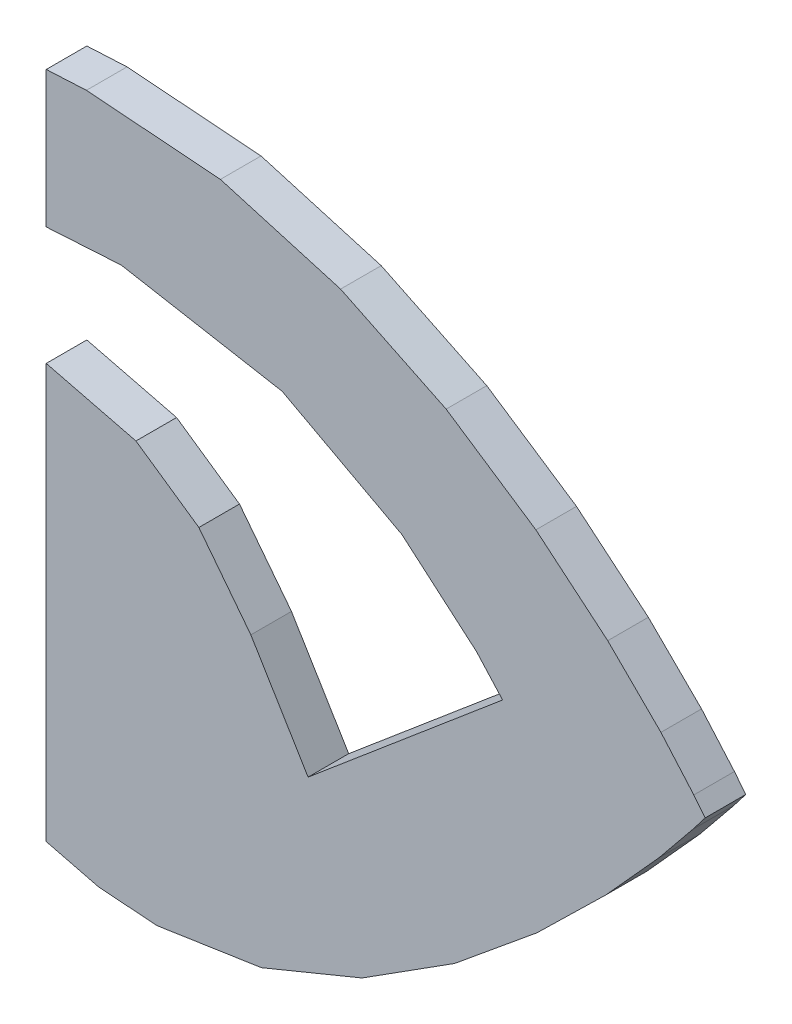
ISO-10303-21;
HEADER;
FILE_DESCRIPTION(('STEP AP214'),'2;1');
FILE_NAME('part.step','',(''),(''),'','','');
FILE_SCHEMA(('AUTOMOTIVE_DESIGN { 1 0 10303 214 1 1 1 1 }'));
ENDSEC;
DATA;
#1=APPLICATION_CONTEXT('core data for automotive mechanical design processes');
#2=APPLICATION_PROTOCOL_DEFINITION('international standard','automotive_design',2000,#1);
#3=PRODUCT_CONTEXT('',#1,'mechanical');
#4=PRODUCT('Part','Part','',(#3));
#5=PRODUCT_RELATED_PRODUCT_CATEGORY('part','',(#4));
#6=PRODUCT_DEFINITION_FORMATION('','',#4);
#7=PRODUCT_DEFINITION_CONTEXT('part definition',#1,'design');
#8=PRODUCT_DEFINITION('design','',#6,#7);
#9=PRODUCT_DEFINITION_SHAPE('','',#8);
#10=(LENGTH_UNIT() NAMED_UNIT(*) SI_UNIT(.MILLI.,.METRE.));
#11=(NAMED_UNIT(*) PLANE_ANGLE_UNIT() SI_UNIT($,.RADIAN.));
#12=(NAMED_UNIT(*) SI_UNIT($,.STERADIAN.) SOLID_ANGLE_UNIT());
#13=UNCERTAINTY_MEASURE_WITH_UNIT(LENGTH_MEASURE(1.E-05),#10,'distance_accuracy_value','');
#14=(GEOMETRIC_REPRESENTATION_CONTEXT(3) GLOBAL_UNCERTAINTY_ASSIGNED_CONTEXT((#13)) GLOBAL_UNIT_ASSIGNED_CONTEXT((#10,
#11,#12)) REPRESENTATION_CONTEXT('',''));
#15=CARTESIAN_POINT('',(0.,0.,0.));
#16=DIRECTION('',(0.,0.,1.));
#17=DIRECTION('',(1.,0.,0.));
#18=AXIS2_PLACEMENT_3D('',#15,#16,#17);
#19=CARTESIAN_POINT('',(0.,0.,0.1));
#20=DIRECTION('',(0.,0.,1.));
#21=DIRECTION('',(1.,0.,0.));
#22=AXIS2_PLACEMENT_3D('',#19,#20,#21);
#23=PLANE('',#22);
#24=DIRECTION('',(-0.998727054653433,-0.0504407603360417,0.));
#25=VECTOR('',#24,1.);
#26=CARTESIAN_POINT('',(-1.174,2.14,0.1));
#27=LINE('',#26,#25);
#28=CARTESIAN_POINT('',(-1.273,2.135,0.1));
#29=VERTEX_POINT('',#28);
#30=CARTESIAN_POINT('',(-1.174,2.14,0.1));
#31=VERTEX_POINT('',#30);
#32=EDGE_CURVE('E232',#29,#31,#27,.F.);
#33=ORIENTED_EDGE('',*,*,#32,.F.);
#34=DIRECTION('',(0.,1.,0.));
#35=VECTOR('',#34,1.);
#36=CARTESIAN_POINT('',(-1.273,2.135,0.1));
#37=LINE('',#36,#35);
#38=CARTESIAN_POINT('',(-1.273,1.799,0.1));
#39=VERTEX_POINT('',#38);
#40=EDGE_CURVE('E20',#39,#29,#37,.T.);
#41=ORIENTED_EDGE('',*,*,#40,.F.);
#42=DIRECTION('',(0.998236959790921,0.0593546300416313,0.));
#43=VECTOR('',#42,1.);
#44=CARTESIAN_POINT('',(-1.273,1.799,0.1));
#45=LINE('',#44,#43);
#46=CARTESIAN_POINT('',(-1.088,1.81,0.1));
#47=VERTEX_POINT('',#46);
#48=EDGE_CURVE('E221',#47,#39,#45,.F.);
#49=ORIENTED_EDGE('',*,*,#48,.F.);
#50=DIRECTION('',(0.984304436673834,-0.176478825767306,0.));
#51=VECTOR('',#50,1.);
#52=CARTESIAN_POINT('',(-1.088,1.81,0.1));
#53=LINE('',#52,#51);
#54=CARTESIAN_POINT('',(-0.692,1.739,0.1));
#55=VERTEX_POINT('',#54);
#56=EDGE_CURVE('E216',#55,#47,#53,.F.);
#57=ORIENTED_EDGE('',*,*,#56,.F.);
#58=DIRECTION('',(0.881524389591205,-0.472138486628503,0.));
#59=VECTOR('',#58,1.);
#60=CARTESIAN_POINT('',(-0.692,1.739,0.1));
#61=LINE('',#60,#59);
#62=CARTESIAN_POINT('',(-0.396999999999999,1.581,0.1));
#63=VERTEX_POINT('',#62);
#64=EDGE_CURVE('E243',#63,#55,#61,.F.);
#65=ORIENTED_EDGE('',*,*,#64,.F.);
#66=DIRECTION('',(0.758674195680899,-0.651470233247799,0.));
#67=VECTOR('',#66,1.);
#68=CARTESIAN_POINT('',(-0.397,1.581,0.1));
#69=LINE('',#68,#67);
#70=CARTESIAN_POINT('',(-0.213000000000001,1.423,0.1));
#71=VERTEX_POINT('',#70);
#72=EDGE_CURVE('E247',#71,#63,#69,.F.);
#73=ORIENTED_EDGE('',*,*,#72,.F.);
#74=DIRECTION('',(0.669542518423765,-0.742773731376361,0.));
#75=VECTOR('',#74,1.);
#76=CARTESIAN_POINT('',(-0.213,1.423,0.1));
#77=LINE('',#76,#75);
#78=CARTESIAN_POINT('',(-0.149,1.352,0.1));
#79=VERTEX_POINT('',#78);
#80=EDGE_CURVE('E251',#79,#71,#77,.F.);
#81=ORIENTED_EDGE('',*,*,#80,.F.);
#82=DIRECTION('',(-0.764414367731665,-0.64472527048767,0.));
#83=VECTOR('',#82,1.);
#84=CARTESIAN_POINT('',(-0.149,1.352,0.1));
#85=LINE('',#84,#83);
#86=CARTESIAN_POINT('',(-0.628,0.948,0.1));
#87=VERTEX_POINT('',#86);
#88=EDGE_CURVE('E255',#87,#79,#85,.F.);
#89=ORIENTED_EDGE('',*,*,#88,.F.);
#90=DIRECTION('',(-0.517731957617027,0.855542880317545,0.));
#91=VECTOR('',#90,1.);
#92=CARTESIAN_POINT('',(-0.628,0.948,0.1));
#93=LINE('',#92,#91);
#94=CARTESIAN_POINT('',(-0.768999999999997,1.181,0.1));
#95=VERTEX_POINT('',#94);
#96=EDGE_CURVE('E259',#95,#87,#93,.F.);
#97=ORIENTED_EDGE('',*,*,#96,.F.);
#98=DIRECTION('',(-0.61294556307577,0.790125139902362,0.));
#99=VECTOR('',#98,1.);
#100=CARTESIAN_POINT('',(-0.769,1.181,0.1));
#101=LINE('',#100,#99);
#102=CARTESIAN_POINT('',(-0.897,1.346,0.1));
#103=VERTEX_POINT('',#102);
#104=EDGE_CURVE('E263',#103,#95,#101,.F.);
#105=ORIENTED_EDGE('',*,*,#104,.F.);
#106=DIRECTION('',(-0.822956002642696,0.568105111501697,0.));
#107=VECTOR('',#106,1.);
#108=CARTESIAN_POINT('',(-0.897,1.346,0.1));
#109=LINE('',#108,#107);
#110=CARTESIAN_POINT('',(-1.052,1.453,0.1));
#111=VERTEX_POINT('',#110);
#112=EDGE_CURVE('E267',#111,#103,#109,.F.);
#113=ORIENTED_EDGE('',*,*,#112,.F.);
#114=DIRECTION('',(-0.970400241258372,0.241502322485093,0.));
#115=VECTOR('',#114,1.);
#116=CARTESIAN_POINT('',(-1.052,1.453,0.1));
#117=LINE('',#116,#115);
#118=CARTESIAN_POINT('',(-1.273,1.508,0.1));
#119=VERTEX_POINT('',#118);
#120=EDGE_CURVE('E271',#119,#111,#117,.F.);
#121=ORIENTED_EDGE('',*,*,#120,.F.);
#122=DIRECTION('',(0.,1.,0.));
#123=VECTOR('',#122,1.);
#124=CARTESIAN_POINT('',(-1.273,1.508,0.1));
#125=LINE('',#124,#123);
#126=CARTESIAN_POINT('',(-1.273,0.488,0.1));
#127=VERTEX_POINT('',#126);
#128=EDGE_CURVE('E275',#127,#119,#125,.T.);
#129=ORIENTED_EDGE('',*,*,#128,.F.);
#130=DIRECTION('',(0.970142500145338,-0.242535625036309,0.));
#131=VECTOR('',#130,1.);
#132=CARTESIAN_POINT('',(-1.273,0.488,0.1));
#133=LINE('',#132,#131);
#134=CARTESIAN_POINT('',(-1.145,0.456000000000001,0.1));
#135=VERTEX_POINT('',#134);
#136=EDGE_CURVE('E279',#135,#127,#133,.F.);
#137=ORIENTED_EDGE('',*,*,#136,.F.);
#138=DIRECTION('',(0.997095075908665,-0.0761669849652373,0.));
#139=VECTOR('',#138,1.);
#140=CARTESIAN_POINT('',(-1.145,0.456,0.1));
#141=LINE('',#140,#139);
#142=CARTESIAN_POINT('',(-1.001,0.445,0.1));
#143=VERTEX_POINT('',#142);
#144=EDGE_CURVE('E283',#143,#135,#141,.F.);
#145=ORIENTED_EDGE('',*,*,#144,.F.);
#146=DIRECTION('',(0.988767049205311,0.149464786507802,0.));
#147=VECTOR('',#146,1.);
#148=CARTESIAN_POINT('',(-1.001,0.445,0.1));
#149=LINE('',#148,#147);
#150=CARTESIAN_POINT('',(-0.743,0.484000000000002,0.1));
#151=VERTEX_POINT('',#150);
#152=EDGE_CURVE('E287',#151,#143,#149,.F.);
#153=ORIENTED_EDGE('',*,*,#152,.F.);
#154=DIRECTION('',(0.924832484767808,0.380374650993203,0.));
#155=VECTOR('',#154,1.);
#156=CARTESIAN_POINT('',(-0.743,0.484,0.1));
#157=LINE('',#156,#155);
#158=CARTESIAN_POINT('',(-0.494999999999999,0.586,0.1));
#159=VERTEX_POINT('',#158);
#160=EDGE_CURVE('E291',#159,#151,#157,.F.);
#161=ORIENTED_EDGE('',*,*,#160,.F.);
#162=DIRECTION('',(0.843813845306443,0.536635998111527,0.));
#163=VECTOR('',#162,1.);
#164=CARTESIAN_POINT('',(-0.495,0.586,0.1));
#165=LINE('',#164,#163);
#166=CARTESIAN_POINT('',(-0.266999999999998,0.731,0.1));
#167=VERTEX_POINT('',#166);
#168=EDGE_CURVE('E295',#167,#159,#165,.F.);
#169=ORIENTED_EDGE('',*,*,#168,.F.);
#170=DIRECTION('',(0.772259570813658,0.635307134610265,0.));
#171=VECTOR('',#170,1.);
#172=CARTESIAN_POINT('',(-0.267,0.731,0.1));
#173=LINE('',#172,#171);
#174=CARTESIAN_POINT('',(-0.0640000000000039,0.897999999999998,0.1));
#175=VERTEX_POINT('',#174);
#176=EDGE_CURVE('E299',#175,#167,#173,.F.);
#177=ORIENTED_EDGE('',*,*,#176,.F.);
#178=DIRECTION('',(0.715474021164301,0.698639338313401,0.));
#179=VECTOR('',#178,1.);
#180=CARTESIAN_POINT('',(-0.064,0.898,0.1));
#181=LINE('',#180,#179);
#182=CARTESIAN_POINT('',(0.106000000000004,1.06400000000001,0.1));
#183=VERTEX_POINT('',#182);
#184=EDGE_CURVE('E303',#183,#175,#181,.F.);
#185=ORIENTED_EDGE('',*,*,#184,.F.);
#186=DIRECTION('',(0.670377163466841,0.742020524448045,0.));
#187=VECTOR('',#186,1.);
#188=CARTESIAN_POINT('',(0.106,1.064,0.1));
#189=LINE('',#188,#187);
#190=CARTESIAN_POINT('',(0.236999999999994,1.20899999999999,0.1));
#191=VERTEX_POINT('',#190);
#192=EDGE_CURVE('E307',#191,#183,#189,.F.);
#193=ORIENTED_EDGE('',*,*,#192,.F.);
#194=DIRECTION('',(0.631165019918396,0.775648578694895,0.));
#195=VECTOR('',#194,1.);
#196=CARTESIAN_POINT('',(0.237,1.209,0.1));
#197=LINE('',#196,#195);
#198=CARTESIAN_POINT('',(0.32,1.311,0.1));
#199=VERTEX_POINT('',#198);
#200=EDGE_CURVE('E311',#199,#191,#197,.F.);
#201=ORIENTED_EDGE('',*,*,#200,.F.);
#202=DIRECTION('',(0.609710760849697,0.792623989104596,0.));
#203=VECTOR('',#202,1.);
#204=CARTESIAN_POINT('',(0.32,1.311,0.1));
#205=LINE('',#204,#203);
#206=CARTESIAN_POINT('',(0.35,1.35,0.1));
#207=VERTEX_POINT('',#206);
#208=EDGE_CURVE('E315',#207,#199,#205,.F.);
#209=ORIENTED_EDGE('',*,*,#208,.F.);
#210=DIRECTION('',(-0.624695047554424,0.78086880944303,0.));
#211=VECTOR('',#210,1.);
#212=CARTESIAN_POINT('',(0.35,1.35,0.1));
#213=LINE('',#212,#211);
#214=CARTESIAN_POINT('',(0.322000000000002,1.385,0.1));
#215=VERTEX_POINT('',#214);
#216=EDGE_CURVE('E319',#215,#207,#213,.F.);
#217=ORIENTED_EDGE('',*,*,#216,.F.);
#218=DIRECTION('',(-0.656780744804204,0.754081595886304,0.));
#219=VECTOR('',#218,1.);
#220=CARTESIAN_POINT('',(0.322,1.385,0.1));
#221=LINE('',#220,#219);
#222=CARTESIAN_POINT('',(0.240999999999999,1.478,0.1));
#223=VERTEX_POINT('',#222);
#224=EDGE_CURVE('E323',#223,#215,#221,.F.);
#225=ORIENTED_EDGE('',*,*,#224,.F.);
#226=DIRECTION('',(-0.709810792663109,0.704392389665709,0.));
#227=VECTOR('',#226,1.);
#228=CARTESIAN_POINT('',(0.241,1.478,0.1));
#229=LINE('',#228,#227);
#230=CARTESIAN_POINT('',(0.110000000000002,1.608,0.1));
#231=VERTEX_POINT('',#230);
#232=EDGE_CURVE('E327',#231,#223,#229,.F.);
#233=ORIENTED_EDGE('',*,*,#232,.F.);
#234=DIRECTION('',(-0.767154426681115,0.641462458467813,0.));
#235=VECTOR('',#234,1.);
#236=CARTESIAN_POINT('',(0.11,1.608,0.1));
#237=LINE('',#236,#235);
#238=CARTESIAN_POINT('',(-0.0669999999999989,1.756,0.1));
#239=VERTEX_POINT('',#238);
#240=EDGE_CURVE('E331',#239,#231,#237,.F.);
#241=ORIENTED_EDGE('',*,*,#240,.F.);
#242=DIRECTION('',(-0.832629463800486,0.553830457821991,0.));
#243=VECTOR('',#242,1.);
#244=CARTESIAN_POINT('',(-0.067,1.756,0.1));
#245=LINE('',#244,#243);
#246=CARTESIAN_POINT('',(-0.288000000000002,1.903,0.1));
#247=VERTEX_POINT('',#246);
#248=EDGE_CURVE('E335',#247,#239,#245,.F.);
#249=ORIENTED_EDGE('',*,*,#248,.F.);
#250=DIRECTION('',(-0.899896437996211,0.436103658413606,0.));
#251=VECTOR('',#250,1.);
#252=CARTESIAN_POINT('',(-0.288,1.903,0.1));
#253=LINE('',#252,#251);
#254=CARTESIAN_POINT('',(-0.547999999999999,2.029,0.1));
#255=VERTEX_POINT('',#254);
#256=EDGE_CURVE('E339',#255,#247,#253,.F.);
#257=ORIENTED_EDGE('',*,*,#256,.F.);
#258=DIRECTION('',(-0.960290165104092,0.279003223645098,0.));
#259=VECTOR('',#258,1.);
#260=CARTESIAN_POINT('',(-0.548,2.029,0.1));
#261=LINE('',#260,#259);
#262=CARTESIAN_POINT('',(-0.844000000000001,2.115,0.1));
#263=VERTEX_POINT('',#262);
#264=EDGE_CURVE('E343',#263,#255,#261,.F.);
#265=ORIENTED_EDGE('',*,*,#264,.F.);
#266=DIRECTION('',(-0.99714268802795,0.0755411127293938,0.));
#267=VECTOR('',#266,1.);
#268=CARTESIAN_POINT('',(-0.844,2.115,0.1));
#269=LINE('',#268,#267);
#270=EDGE_CURVE('E347',#31,#263,#269,.F.);
#271=ORIENTED_EDGE('',*,*,#270,.F.);
#272=EDGE_LOOP('',(#33,#41,#49,#57,#65,#73,#81,#89,#97,#105,#113,#121,#129,#137,#145,#153,#161,
#169,#177,#185,#193,#201,#209,#217,#225,#233,#241,#249,#257,#265,#271));
#273=FACE_BOUND('',#272,.T.);
#274=ADVANCED_FACE('F17',(#273),#23,.T.);
#275=CARTESIAN_POINT('',(-1.273,2.135,0.));
#276=DIRECTION('',(-1.,0.,0.));
#277=DIRECTION('',(0.,0.,1.));
#278=AXIS2_PLACEMENT_3D('',#275,#276,#277);
#279=PLANE('',#278);
#280=DIRECTION('',(0.,0.,1.));
#281=VECTOR('',#280,1.);
#282=CARTESIAN_POINT('',(-1.273,2.135,0.));
#283=LINE('',#282,#281);
#284=CARTESIAN_POINT('',(-1.273,2.135,0.));
#285=VERTEX_POINT('',#284);
#286=EDGE_CURVE('E351',#285,#29,#283,.T.);
#287=ORIENTED_EDGE('',*,*,#286,.F.);
#288=DIRECTION('',(0.,1.,0.));
#289=VECTOR('',#288,1.);
#290=CARTESIAN_POINT('',(-1.273,0.,0.));
#291=LINE('',#290,#289);
#292=CARTESIAN_POINT('',(-1.273,1.799,0.));
#293=VERTEX_POINT('',#292);
#294=EDGE_CURVE('E238',#285,#293,#291,.F.);
#295=ORIENTED_EDGE('',*,*,#294,.T.);
#296=DIRECTION('',(0.,0.,1.));
#297=VECTOR('',#296,1.);
#298=CARTESIAN_POINT('',(-1.273,1.799,0.));
#299=LINE('',#298,#297);
#300=EDGE_CURVE('E226',#39,#293,#299,.F.);
#301=ORIENTED_EDGE('',*,*,#300,.F.);
#302=ORIENTED_EDGE('',*,*,#40,.T.);
#303=EDGE_LOOP('',(#287,#295,#301,#302));
#304=FACE_BOUND('',#303,.T.);
#305=ADVANCED_FACE('F237',(#304),#279,.T.);
#306=CARTESIAN_POINT('',(-1.273,1.799,0.));
#307=DIRECTION('',(0.0593546300416313,-0.998236959790921,0.));
#308=DIRECTION('',(0.998236959790921,0.0593546300416313,0.));
#309=AXIS2_PLACEMENT_3D('',#306,#307,#308);
#310=PLANE('',#309);
#311=ORIENTED_EDGE('',*,*,#300,.T.);
#312=DIRECTION('',(0.998236959790922,0.0593546300416233,0.));
#313=VECTOR('',#312,1.);
#314=CARTESIAN_POINT('',(-1.273,1.799,0.));
#315=LINE('',#314,#313);
#316=CARTESIAN_POINT('',(-1.088,1.81,0.));
#317=VERTEX_POINT('',#316);
#318=EDGE_CURVE('E356',#293,#317,#315,.T.);
#319=ORIENTED_EDGE('',*,*,#318,.T.);
#320=DIRECTION('',(0.,0.,1.));
#321=VECTOR('',#320,1.);
#322=CARTESIAN_POINT('',(-1.088,1.81,0.));
#323=LINE('',#322,#321);
#324=EDGE_CURVE('E228',#47,#317,#323,.F.);
#325=ORIENTED_EDGE('',*,*,#324,.F.);
#326=ORIENTED_EDGE('',*,*,#48,.T.);
#327=EDGE_LOOP('',(#311,#319,#325,#326));
#328=FACE_BOUND('',#327,.T.);
#329=ADVANCED_FACE('F223',(#328),#310,.T.);
#330=CARTESIAN_POINT('',(-1.088,1.81,0.));
#331=DIRECTION('',(-0.176478825767306,-0.984304436673834,0.));
#332=DIRECTION('',(0.984304436673834,-0.176478825767306,0.));
#333=AXIS2_PLACEMENT_3D('',#330,#331,#332);
#334=PLANE('',#333);
#335=ORIENTED_EDGE('',*,*,#324,.T.);
#336=DIRECTION('',(0.984304436673838,-0.176478825767279,0.));
#337=VECTOR('',#336,1.);
#338=CARTESIAN_POINT('',(-1.088,1.81,0.));
#339=LINE('',#338,#337);
#340=CARTESIAN_POINT('',(-0.692000000000001,1.73899999999999,0.));
#341=VERTEX_POINT('',#340);
#342=EDGE_CURVE('E358',#317,#341,#339,.T.);
#343=ORIENTED_EDGE('',*,*,#342,.T.);
#344=DIRECTION('',(0.,0.,1.));
#345=VECTOR('',#344,1.);
#346=CARTESIAN_POINT('',(-0.692,1.739,0.));
#347=LINE('',#346,#345);
#348=EDGE_CURVE('E245',#55,#341,#347,.F.);
#349=ORIENTED_EDGE('',*,*,#348,.F.);
#350=ORIENTED_EDGE('',*,*,#56,.T.);
#351=EDGE_LOOP('',(#335,#343,#349,#350));
#352=FACE_BOUND('',#351,.T.);
#353=ADVANCED_FACE('F576',(#352),#334,.T.);
#354=CARTESIAN_POINT('',(-0.692,1.739,0.));
#355=DIRECTION('',(-0.472138486628503,-0.881524389591205,0.));
#356=DIRECTION('',(0.881524389591205,-0.472138486628503,0.));
#357=AXIS2_PLACEMENT_3D('',#354,#355,#356);
#358=PLANE('',#357);
#359=ORIENTED_EDGE('',*,*,#348,.T.);
#360=DIRECTION('',(0.881524389591202,-0.472138486628509,0.));
#361=VECTOR('',#360,1.);
#362=CARTESIAN_POINT('',(-0.692,1.739,0.));
#363=LINE('',#362,#361);
#364=CARTESIAN_POINT('',(-0.396999999999999,1.581,0.));
#365=VERTEX_POINT('',#364);
#366=EDGE_CURVE('E361',#341,#365,#363,.T.);
#367=ORIENTED_EDGE('',*,*,#366,.T.);
#368=DIRECTION('',(0.,0.,1.));
#369=VECTOR('',#368,1.);
#370=CARTESIAN_POINT('',(-0.397,1.581,0.));
#371=LINE('',#370,#369);
#372=EDGE_CURVE('E249',#63,#365,#371,.F.);
#373=ORIENTED_EDGE('',*,*,#372,.F.);
#374=ORIENTED_EDGE('',*,*,#64,.T.);
#375=EDGE_LOOP('',(#359,#367,#373,#374));
#376=FACE_BOUND('',#375,.T.);
#377=ADVANCED_FACE('F574',(#376),#358,.T.);
#378=CARTESIAN_POINT('',(-0.397,1.581,0.));
#379=DIRECTION('',(-0.651470233247799,-0.758674195680899,0.));
#380=DIRECTION('',(0.758674195680899,-0.651470233247799,0.));
#381=AXIS2_PLACEMENT_3D('',#378,#379,#380);
#382=PLANE('',#381);
#383=ORIENTED_EDGE('',*,*,#372,.T.);
#384=DIRECTION('',(0.758674195680934,-0.651470233247758,0.));
#385=VECTOR('',#384,1.);
#386=CARTESIAN_POINT('',(-0.397,1.581,0.));
#387=LINE('',#386,#385);
#388=CARTESIAN_POINT('',(-0.213000000000004,1.42299999999999,0.));
#389=VERTEX_POINT('',#388);
#390=EDGE_CURVE('E364',#365,#389,#387,.T.);
#391=ORIENTED_EDGE('',*,*,#390,.T.);
#392=DIRECTION('',(0.,0.,1.));
#393=VECTOR('',#392,1.);
#394=CARTESIAN_POINT('',(-0.213,1.423,0.));
#395=LINE('',#394,#393);
#396=EDGE_CURVE('E253',#71,#389,#395,.F.);
#397=ORIENTED_EDGE('',*,*,#396,.F.);
#398=ORIENTED_EDGE('',*,*,#72,.T.);
#399=EDGE_LOOP('',(#383,#391,#397,#398));
#400=FACE_BOUND('',#399,.T.);
#401=ADVANCED_FACE('F570',(#400),#382,.T.);
#402=CARTESIAN_POINT('',(-0.213,1.423,0.));
#403=DIRECTION('',(-0.742773731376361,-0.669542518423765,0.));
#404=DIRECTION('',(0.669542518423765,-0.742773731376361,0.));
#405=AXIS2_PLACEMENT_3D('',#402,#403,#404);
#406=PLANE('',#405);
#407=ORIENTED_EDGE('',*,*,#396,.T.);
#408=DIRECTION('',(0.669542518423764,-0.742773731376362,0.));
#409=VECTOR('',#408,1.);
#410=CARTESIAN_POINT('',(-0.213,1.423,0.));
#411=LINE('',#410,#409);
#412=CARTESIAN_POINT('',(-0.149,1.352,0.));
#413=VERTEX_POINT('',#412);
#414=EDGE_CURVE('E367',#389,#413,#411,.T.);
#415=ORIENTED_EDGE('',*,*,#414,.T.);
#416=DIRECTION('',(0.,0.,1.));
#417=VECTOR('',#416,1.);
#418=CARTESIAN_POINT('',(-0.149,1.352,0.));
#419=LINE('',#418,#417);
#420=EDGE_CURVE('E257',#79,#413,#419,.F.);
#421=ORIENTED_EDGE('',*,*,#420,.F.);
#422=ORIENTED_EDGE('',*,*,#80,.T.);
#423=EDGE_LOOP('',(#407,#415,#421,#422));
#424=FACE_BOUND('',#423,.T.);
#425=ADVANCED_FACE('F564',(#424),#406,.T.);
#426=CARTESIAN_POINT('',(-0.149,1.352,0.));
#427=DIRECTION('',(-0.64472527048767,0.764414367731665,0.));
#428=DIRECTION('',(-0.764414367731665,-0.64472527048767,0.));
#429=AXIS2_PLACEMENT_3D('',#426,#427,#428);
#430=PLANE('',#429);
#431=ORIENTED_EDGE('',*,*,#420,.T.);
#432=DIRECTION('',(-0.764414367731666,-0.644725270487668,0.));
#433=VECTOR('',#432,1.);
#434=CARTESIAN_POINT('',(-0.149,1.352,0.));
#435=LINE('',#434,#433);
#436=CARTESIAN_POINT('',(-0.628,0.947999999999999,0.));
#437=VERTEX_POINT('',#436);
#438=EDGE_CURVE('E370',#413,#437,#435,.T.);
#439=ORIENTED_EDGE('',*,*,#438,.T.);
#440=DIRECTION('',(0.,0.,1.));
#441=VECTOR('',#440,1.);
#442=CARTESIAN_POINT('',(-0.628,0.948,0.));
#443=LINE('',#442,#441);
#444=EDGE_CURVE('E261',#87,#437,#443,.F.);
#445=ORIENTED_EDGE('',*,*,#444,.F.);
#446=ORIENTED_EDGE('',*,*,#88,.T.);
#447=EDGE_LOOP('',(#431,#439,#445,#446));
#448=FACE_BOUND('',#447,.T.);
#449=ADVANCED_FACE('F560',(#448),#430,.T.);
#450=CARTESIAN_POINT('',(-0.628,0.948,0.));
#451=DIRECTION('',(0.855542880317545,0.517731957617027,0.));
#452=DIRECTION('',(-0.517731957617027,0.855542880317545,0.));
#453=AXIS2_PLACEMENT_3D('',#450,#451,#452);
#454=PLANE('',#453);
#455=ORIENTED_EDGE('',*,*,#444,.T.);
#456=DIRECTION('',(-0.517731957617048,0.855542880317532,0.));
#457=VECTOR('',#456,1.);
#458=CARTESIAN_POINT('',(-0.628,0.948,0.));
#459=LINE('',#458,#457);
#460=CARTESIAN_POINT('',(-0.768999999999996,1.181,0.));
#461=VERTEX_POINT('',#460);
#462=EDGE_CURVE('E373',#437,#461,#459,.T.);
#463=ORIENTED_EDGE('',*,*,#462,.T.);
#464=DIRECTION('',(0.,0.,1.));
#465=VECTOR('',#464,1.);
#466=CARTESIAN_POINT('',(-0.769,1.181,0.));
#467=LINE('',#466,#465);
#468=EDGE_CURVE('E265',#95,#461,#467,.F.);
#469=ORIENTED_EDGE('',*,*,#468,.F.);
#470=ORIENTED_EDGE('',*,*,#96,.T.);
#471=EDGE_LOOP('',(#455,#463,#469,#470));
#472=FACE_BOUND('',#471,.T.);
#473=ADVANCED_FACE('F554',(#472),#454,.T.);
#474=CARTESIAN_POINT('',(-0.769,1.181,0.));
#475=DIRECTION('',(0.790125139902362,0.61294556307577,0.));
#476=DIRECTION('',(-0.61294556307577,0.790125139902362,0.));
#477=AXIS2_PLACEMENT_3D('',#474,#475,#476);
#478=PLANE('',#477);
#479=ORIENTED_EDGE('',*,*,#468,.T.);
#480=DIRECTION('',(-0.612945563075771,0.790125139902362,0.));
#481=VECTOR('',#480,1.);
#482=CARTESIAN_POINT('',(-0.769,1.181,0.));
#483=LINE('',#482,#481);
#484=CARTESIAN_POINT('',(-0.897,1.346,0.));
#485=VERTEX_POINT('',#484);
#486=EDGE_CURVE('E376',#461,#485,#483,.T.);
#487=ORIENTED_EDGE('',*,*,#486,.T.);
#488=DIRECTION('',(0.,0.,1.));
#489=VECTOR('',#488,1.);
#490=CARTESIAN_POINT('',(-0.897,1.346,0.));
#491=LINE('',#490,#489);
#492=EDGE_CURVE('E269',#103,#485,#491,.F.);
#493=ORIENTED_EDGE('',*,*,#492,.F.);
#494=ORIENTED_EDGE('',*,*,#104,.T.);
#495=EDGE_LOOP('',(#479,#487,#493,#494));
#496=FACE_BOUND('',#495,.T.);
#497=ADVANCED_FACE('F550',(#496),#478,.T.);
#498=CARTESIAN_POINT('',(-0.897,1.346,0.));
#499=DIRECTION('',(0.568105111501697,0.822956002642696,0.));
#500=DIRECTION('',(-0.822956002642696,0.568105111501697,0.));
#501=AXIS2_PLACEMENT_3D('',#498,#499,#500);
#502=PLANE('',#501);
#503=ORIENTED_EDGE('',*,*,#492,.T.);
#504=DIRECTION('',(-0.82295600264268,0.56810511150172,0.));
#505=VECTOR('',#504,1.);
#506=CARTESIAN_POINT('',(-0.897,1.346,0.));
#507=LINE('',#506,#505);
#508=CARTESIAN_POINT('',(-1.052,1.453,0.));
#509=VERTEX_POINT('',#508);
#510=EDGE_CURVE('E379',#485,#509,#507,.T.);
#511=ORIENTED_EDGE('',*,*,#510,.T.);
#512=DIRECTION('',(0.,0.,1.));
#513=VECTOR('',#512,1.);
#514=CARTESIAN_POINT('',(-1.052,1.453,0.));
#515=LINE('',#514,#513);
#516=EDGE_CURVE('E273',#111,#509,#515,.F.);
#517=ORIENTED_EDGE('',*,*,#516,.F.);
#518=ORIENTED_EDGE('',*,*,#112,.T.);
#519=EDGE_LOOP('',(#503,#511,#517,#518));
#520=FACE_BOUND('',#519,.T.);
#521=ADVANCED_FACE('F544',(#520),#502,.T.);
#522=CARTESIAN_POINT('',(-1.052,1.453,0.));
#523=DIRECTION('',(0.241502322485093,0.970400241258372,0.));
#524=DIRECTION('',(-0.970400241258372,0.241502322485093,0.));
#525=AXIS2_PLACEMENT_3D('',#522,#523,#524);
#526=PLANE('',#525);
#527=ORIENTED_EDGE('',*,*,#516,.T.);
#528=DIRECTION('',(-0.970400241258367,0.241502322485113,0.));
#529=VECTOR('',#528,1.);
#530=CARTESIAN_POINT('',(-1.052,1.453,0.));
#531=LINE('',#530,#529);
#532=CARTESIAN_POINT('',(-1.273,1.508,0.));
#533=VERTEX_POINT('',#532);
#534=EDGE_CURVE('E382',#509,#533,#531,.T.);
#535=ORIENTED_EDGE('',*,*,#534,.T.);
#536=DIRECTION('',(0.,0.,1.));
#537=VECTOR('',#536,1.);
#538=CARTESIAN_POINT('',(-1.273,1.508,0.));
#539=LINE('',#538,#537);
#540=EDGE_CURVE('E277',#119,#533,#539,.F.);
#541=ORIENTED_EDGE('',*,*,#540,.F.);
#542=ORIENTED_EDGE('',*,*,#120,.T.);
#543=EDGE_LOOP('',(#527,#535,#541,#542));
#544=FACE_BOUND('',#543,.T.);
#545=ADVANCED_FACE('F540',(#544),#526,.T.);
#546=CARTESIAN_POINT('',(-1.273,1.508,0.));
#547=DIRECTION('',(-1.,0.,0.));
#548=DIRECTION('',(0.,0.,1.));
#549=AXIS2_PLACEMENT_3D('',#546,#547,#548);
#550=PLANE('',#549);
#551=ORIENTED_EDGE('',*,*,#540,.T.);
#552=DIRECTION('',(0.,1.,0.));
#553=VECTOR('',#552,1.);
#554=CARTESIAN_POINT('',(-1.273,0.,0.));
#555=LINE('',#554,#553);
#556=CARTESIAN_POINT('',(-1.273,0.488,0.));
#557=VERTEX_POINT('',#556);
#558=EDGE_CURVE('E385',#533,#557,#555,.F.);
#559=ORIENTED_EDGE('',*,*,#558,.T.);
#560=DIRECTION('',(0.,0.,1.));
#561=VECTOR('',#560,1.);
#562=CARTESIAN_POINT('',(-1.273,0.488,0.));
#563=LINE('',#562,#561);
#564=EDGE_CURVE('E281',#127,#557,#563,.F.);
#565=ORIENTED_EDGE('',*,*,#564,.F.);
#566=ORIENTED_EDGE('',*,*,#128,.T.);
#567=EDGE_LOOP('',(#551,#559,#565,#566));
#568=FACE_BOUND('',#567,.T.);
#569=ADVANCED_FACE('F534',(#568),#550,.T.);
#570=CARTESIAN_POINT('',(-1.273,0.488,0.));
#571=DIRECTION('',(-0.242535625036309,-0.970142500145338,0.));
#572=DIRECTION('',(0.970142500145338,-0.242535625036309,0.));
#573=AXIS2_PLACEMENT_3D('',#570,#571,#572);
#574=PLANE('',#573);
#575=ORIENTED_EDGE('',*,*,#564,.T.);
#576=DIRECTION('',(0.970142500145332,-0.242535625036333,0.));
#577=VECTOR('',#576,1.);
#578=CARTESIAN_POINT('',(-1.273,0.488,0.));
#579=LINE('',#578,#577);
#580=CARTESIAN_POINT('',(-1.145,0.456000000000002,0.));
#581=VERTEX_POINT('',#580);
#582=EDGE_CURVE('E388',#557,#581,#579,.T.);
#583=ORIENTED_EDGE('',*,*,#582,.T.);
#584=DIRECTION('',(0.,0.,1.));
#585=VECTOR('',#584,1.);
#586=CARTESIAN_POINT('',(-1.145,0.456,0.));
#587=LINE('',#586,#585);
#588=EDGE_CURVE('E285',#135,#581,#587,.F.);
#589=ORIENTED_EDGE('',*,*,#588,.F.);
#590=ORIENTED_EDGE('',*,*,#136,.T.);
#591=EDGE_LOOP('',(#575,#583,#589,#590));
#592=FACE_BOUND('',#591,.T.);
#593=ADVANCED_FACE('F530',(#592),#574,.T.);
#594=CARTESIAN_POINT('',(-1.145,0.456,0.));
#595=DIRECTION('',(-0.0761669849652373,-0.997095075908665,0.));
#596=DIRECTION('',(0.997095075908665,-0.0761669849652373,0.));
#597=AXIS2_PLACEMENT_3D('',#594,#595,#596);
#598=PLANE('',#597);
#599=ORIENTED_EDGE('',*,*,#588,.T.);
#600=DIRECTION('',(0.997095075908664,-0.0761669849652451,0.));
#601=VECTOR('',#600,1.);
#602=CARTESIAN_POINT('',(-1.145,0.456,0.));
#603=LINE('',#602,#601);
#604=CARTESIAN_POINT('',(-1.001,0.445000000000001,0.));
#605=VERTEX_POINT('',#604);
#606=EDGE_CURVE('E391',#581,#605,#603,.T.);
#607=ORIENTED_EDGE('',*,*,#606,.T.);
#608=DIRECTION('',(0.,0.,1.));
#609=VECTOR('',#608,1.);
#610=CARTESIAN_POINT('',(-1.001,0.445,0.));
#611=LINE('',#610,#609);
#612=EDGE_CURVE('E289',#143,#605,#611,.F.);
#613=ORIENTED_EDGE('',*,*,#612,.F.);
#614=ORIENTED_EDGE('',*,*,#144,.T.);
#615=EDGE_LOOP('',(#599,#607,#613,#614));
#616=FACE_BOUND('',#615,.T.);
#617=ADVANCED_FACE('F524',(#616),#598,.T.);
#618=CARTESIAN_POINT('',(-1.001,0.445,0.));
#619=DIRECTION('',(0.149464786507802,-0.988767049205311,0.));
#620=DIRECTION('',(0.988767049205311,0.149464786507802,0.));
#621=AXIS2_PLACEMENT_3D('',#618,#619,#620);
#622=PLANE('',#621);
#623=ORIENTED_EDGE('',*,*,#612,.T.);
#624=DIRECTION('',(0.988767049205314,0.14946478650778,0.));
#625=VECTOR('',#624,1.);
#626=CARTESIAN_POINT('',(-1.001,0.445,0.));
#627=LINE('',#626,#625);
#628=CARTESIAN_POINT('',(-0.743,0.484000000000003,0.));
#629=VERTEX_POINT('',#628);
#630=EDGE_CURVE('E394',#605,#629,#627,.T.);
#631=ORIENTED_EDGE('',*,*,#630,.T.);
#632=DIRECTION('',(0.,0.,1.));
#633=VECTOR('',#632,1.);
#634=CARTESIAN_POINT('',(-0.743,0.484,0.));
#635=LINE('',#634,#633);
#636=EDGE_CURVE('E293',#151,#629,#635,.F.);
#637=ORIENTED_EDGE('',*,*,#636,.F.);
#638=ORIENTED_EDGE('',*,*,#152,.T.);
#639=EDGE_LOOP('',(#623,#631,#637,#638));
#640=FACE_BOUND('',#639,.T.);
#641=ADVANCED_FACE('F520',(#640),#622,.T.);
#642=CARTESIAN_POINT('',(-0.743,0.484,0.));
#643=DIRECTION('',(0.380374650993203,-0.924832484767808,0.));
#644=DIRECTION('',(0.924832484767808,0.380374650993203,0.));
#645=AXIS2_PLACEMENT_3D('',#642,#643,#644);
#646=PLANE('',#645);
#647=ORIENTED_EDGE('',*,*,#636,.T.);
#648=DIRECTION('',(0.924832484767806,0.38037465099321,0.));
#649=VECTOR('',#648,1.);
#650=CARTESIAN_POINT('',(-0.743,0.484,0.));
#651=LINE('',#650,#649);
#652=CARTESIAN_POINT('',(-0.494999999999999,0.585999999999999,0.));
#653=VERTEX_POINT('',#652);
#654=EDGE_CURVE('E397',#629,#653,#651,.T.);
#655=ORIENTED_EDGE('',*,*,#654,.T.);
#656=DIRECTION('',(0.,0.,1.));
#657=VECTOR('',#656,1.);
#658=CARTESIAN_POINT('',(-0.495,0.586,0.));
#659=LINE('',#658,#657);
#660=EDGE_CURVE('E297',#159,#653,#659,.F.);
#661=ORIENTED_EDGE('',*,*,#660,.F.);
#662=ORIENTED_EDGE('',*,*,#160,.T.);
#663=EDGE_LOOP('',(#647,#655,#661,#662));
#664=FACE_BOUND('',#663,.T.);
#665=ADVANCED_FACE('F514',(#664),#646,.T.);
#666=CARTESIAN_POINT('',(-0.495,0.586,0.));
#667=DIRECTION('',(0.536635998111527,-0.843813845306443,0.));
#668=DIRECTION('',(0.843813845306443,0.536635998111527,0.));
#669=AXIS2_PLACEMENT_3D('',#666,#667,#668);
#670=PLANE('',#669);
#671=ORIENTED_EDGE('',*,*,#660,.T.);
#672=DIRECTION('',(0.843813845306431,0.536635998111546,0.));
#673=VECTOR('',#672,1.);
#674=CARTESIAN_POINT('',(-0.495,0.586,0.));
#675=LINE('',#674,#673);
#676=CARTESIAN_POINT('',(-0.266999999999998,0.730999999999998,0.));
#677=VERTEX_POINT('',#676);
#678=EDGE_CURVE('E400',#653,#677,#675,.T.);
#679=ORIENTED_EDGE('',*,*,#678,.T.);
#680=DIRECTION('',(0.,0.,1.));
#681=VECTOR('',#680,1.);
#682=CARTESIAN_POINT('',(-0.267,0.731,0.));
#683=LINE('',#682,#681);
#684=EDGE_CURVE('E301',#167,#677,#683,.F.);
#685=ORIENTED_EDGE('',*,*,#684,.F.);
#686=ORIENTED_EDGE('',*,*,#168,.T.);
#687=EDGE_LOOP('',(#671,#679,#685,#686));
#688=FACE_BOUND('',#687,.T.);
#689=ADVANCED_FACE('F510',(#688),#670,.T.);
#690=CARTESIAN_POINT('',(-0.267,0.731,0.));
#691=DIRECTION('',(0.635307134610265,-0.772259570813658,0.));
#692=DIRECTION('',(0.772259570813658,0.635307134610265,0.));
#693=AXIS2_PLACEMENT_3D('',#690,#691,#692);
#694=PLANE('',#693);
#695=ORIENTED_EDGE('',*,*,#684,.T.);
#696=DIRECTION('',(0.772259570813665,0.635307134610256,0.));
#697=VECTOR('',#696,1.);
#698=CARTESIAN_POINT('',(-0.267,0.731,0.));
#699=LINE('',#698,#697);
#700=CARTESIAN_POINT('',(-0.0640000000000026,0.898,0.));
#701=VERTEX_POINT('',#700);
#702=EDGE_CURVE('E403',#677,#701,#699,.T.);
#703=ORIENTED_EDGE('',*,*,#702,.T.);
#704=DIRECTION('',(0.,0.,1.));
#705=VECTOR('',#704,1.);
#706=CARTESIAN_POINT('',(-0.064,0.898,0.));
#707=LINE('',#706,#705);
#708=EDGE_CURVE('E305',#175,#701,#707,.F.);
#709=ORIENTED_EDGE('',*,*,#708,.F.);
#710=ORIENTED_EDGE('',*,*,#176,.T.);
#711=EDGE_LOOP('',(#695,#703,#709,#710));
#712=FACE_BOUND('',#711,.T.);
#713=ADVANCED_FACE('F504',(#712),#694,.T.);
#714=CARTESIAN_POINT('',(-0.064,0.898,0.));
#715=DIRECTION('',(0.698639338313401,-0.715474021164301,0.));
#716=DIRECTION('',(0.715474021164301,0.698639338313401,0.));
#717=AXIS2_PLACEMENT_3D('',#714,#715,#716);
#718=PLANE('',#717);
#719=ORIENTED_EDGE('',*,*,#708,.T.);
#720=DIRECTION('',(0.715474021164313,0.698639338313388,0.));
#721=VECTOR('',#720,1.);
#722=CARTESIAN_POINT('',(-0.064,0.898,0.));
#723=LINE('',#722,#721);
#724=CARTESIAN_POINT('',(0.106000000000001,1.064,0.));
#725=VERTEX_POINT('',#724);
#726=EDGE_CURVE('E406',#701,#725,#723,.T.);
#727=ORIENTED_EDGE('',*,*,#726,.T.);
#728=DIRECTION('',(0.,0.,1.));
#729=VECTOR('',#728,1.);
#730=CARTESIAN_POINT('',(0.106,1.064,0.));
#731=LINE('',#730,#729);
#732=EDGE_CURVE('E309',#183,#725,#731,.F.);
#733=ORIENTED_EDGE('',*,*,#732,.F.);
#734=ORIENTED_EDGE('',*,*,#184,.T.);
#735=EDGE_LOOP('',(#719,#727,#733,#734));
#736=FACE_BOUND('',#735,.T.);
#737=ADVANCED_FACE('F500',(#736),#718,.T.);
#738=CARTESIAN_POINT('',(0.106,1.064,0.));
#739=DIRECTION('',(0.742020524448045,-0.670377163466841,0.));
#740=DIRECTION('',(0.670377163466841,0.742020524448045,0.));
#741=AXIS2_PLACEMENT_3D('',#738,#739,#740);
#742=PLANE('',#741);
#743=ORIENTED_EDGE('',*,*,#732,.T.);
#744=DIRECTION('',(0.670377163466849,0.742020524448038,0.));
#745=VECTOR('',#744,1.);
#746=CARTESIAN_POINT('',(0.106,1.064,0.));
#747=LINE('',#746,#745);
#748=CARTESIAN_POINT('',(0.236999999999997,1.209,0.));
#749=VERTEX_POINT('',#748);
#750=EDGE_CURVE('E409',#725,#749,#747,.T.);
#751=ORIENTED_EDGE('',*,*,#750,.T.);
#752=DIRECTION('',(0.,0.,1.));
#753=VECTOR('',#752,1.);
#754=CARTESIAN_POINT('',(0.237,1.209,0.));
#755=LINE('',#754,#753);
#756=EDGE_CURVE('E313',#191,#749,#755,.F.);
#757=ORIENTED_EDGE('',*,*,#756,.F.);
#758=ORIENTED_EDGE('',*,*,#192,.T.);
#759=EDGE_LOOP('',(#743,#751,#757,#758));
#760=FACE_BOUND('',#759,.T.);
#761=ADVANCED_FACE('F494',(#760),#742,.T.);
#762=CARTESIAN_POINT('',(0.237,1.209,0.));
#763=DIRECTION('',(0.775648578694895,-0.631165019918396,0.));
#764=DIRECTION('',(0.631165019918396,0.775648578694895,0.));
#765=AXIS2_PLACEMENT_3D('',#762,#763,#764);
#766=PLANE('',#765);
#767=ORIENTED_EDGE('',*,*,#756,.T.);
#768=DIRECTION('',(0.631165019918396,0.775648578694895,0.));
#769=VECTOR('',#768,1.);
#770=CARTESIAN_POINT('',(0.237,1.209,0.));
#771=LINE('',#770,#769);
#772=CARTESIAN_POINT('',(0.32,1.311,0.));
#773=VERTEX_POINT('',#772);
#774=EDGE_CURVE('E412',#749,#773,#771,.T.);
#775=ORIENTED_EDGE('',*,*,#774,.T.);
#776=DIRECTION('',(0.,0.,1.));
#777=VECTOR('',#776,1.);
#778=CARTESIAN_POINT('',(0.32,1.311,0.));
#779=LINE('',#778,#777);
#780=EDGE_CURVE('E317',#199,#773,#779,.F.);
#781=ORIENTED_EDGE('',*,*,#780,.F.);
#782=ORIENTED_EDGE('',*,*,#200,.T.);
#783=EDGE_LOOP('',(#767,#775,#781,#782));
#784=FACE_BOUND('',#783,.T.);
#785=ADVANCED_FACE('F490',(#784),#766,.T.);
#786=CARTESIAN_POINT('',(0.32,1.311,0.));
#787=DIRECTION('',(0.792623989104596,-0.609710760849697,0.));
#788=DIRECTION('',(0.609710760849697,0.792623989104596,0.));
#789=AXIS2_PLACEMENT_3D('',#786,#787,#788);
#790=PLANE('',#789);
#791=ORIENTED_EDGE('',*,*,#780,.T.);
#792=DIRECTION('',(0.60971076084969,0.792623989104602,0.));
#793=VECTOR('',#792,1.);
#794=CARTESIAN_POINT('',(0.32,1.311,0.));
#795=LINE('',#794,#793);
#796=CARTESIAN_POINT('',(0.35,1.35,0.));
#797=VERTEX_POINT('',#796);
#798=EDGE_CURVE('E415',#773,#797,#795,.T.);
#799=ORIENTED_EDGE('',*,*,#798,.T.);
#800=DIRECTION('',(0.,0.,1.));
#801=VECTOR('',#800,1.);
#802=CARTESIAN_POINT('',(0.35,1.35,0.));
#803=LINE('',#802,#801);
#804=EDGE_CURVE('E321',#207,#797,#803,.F.);
#805=ORIENTED_EDGE('',*,*,#804,.F.);
#806=ORIENTED_EDGE('',*,*,#208,.T.);
#807=EDGE_LOOP('',(#791,#799,#805,#806));
#808=FACE_BOUND('',#807,.T.);
#809=ADVANCED_FACE('F484',(#808),#790,.T.);
#810=CARTESIAN_POINT('',(0.35,1.35,0.));
#811=DIRECTION('',(0.78086880944303,0.624695047554424,0.));
#812=DIRECTION('',(-0.624695047554424,0.78086880944303,0.));
#813=AXIS2_PLACEMENT_3D('',#810,#811,#812);
#814=PLANE('',#813);
#815=ORIENTED_EDGE('',*,*,#804,.T.);
#816=DIRECTION('',(-0.624695047554425,0.780868809443029,0.));
#817=VECTOR('',#816,1.);
#818=CARTESIAN_POINT('',(0.35,1.35,0.));
#819=LINE('',#818,#817);
#820=CARTESIAN_POINT('',(0.322000000000001,1.385,0.));
#821=VERTEX_POINT('',#820);
#822=EDGE_CURVE('E418',#797,#821,#819,.T.);
#823=ORIENTED_EDGE('',*,*,#822,.T.);
#824=DIRECTION('',(0.,0.,1.));
#825=VECTOR('',#824,1.);
#826=CARTESIAN_POINT('',(0.322,1.385,0.));
#827=LINE('',#826,#825);
#828=EDGE_CURVE('E325',#215,#821,#827,.F.);
#829=ORIENTED_EDGE('',*,*,#828,.F.);
#830=ORIENTED_EDGE('',*,*,#216,.T.);
#831=EDGE_LOOP('',(#815,#823,#829,#830));
#832=FACE_BOUND('',#831,.T.);
#833=ADVANCED_FACE('F480',(#832),#814,.T.);
#834=CARTESIAN_POINT('',(0.322,1.385,0.));
#835=DIRECTION('',(0.754081595886304,0.656780744804204,0.));
#836=DIRECTION('',(-0.656780744804204,0.754081595886304,0.));
#837=AXIS2_PLACEMENT_3D('',#834,#835,#836);
#838=PLANE('',#837);
#839=ORIENTED_EDGE('',*,*,#828,.T.);
#840=DIRECTION('',(-0.656780744804202,0.754081595886306,0.));
#841=VECTOR('',#840,1.);
#842=CARTESIAN_POINT('',(0.322,1.385,0.));
#843=LINE('',#842,#841);
#844=CARTESIAN_POINT('',(0.240999999999999,1.478,0.));
#845=VERTEX_POINT('',#844);
#846=EDGE_CURVE('E421',#821,#845,#843,.T.);
#847=ORIENTED_EDGE('',*,*,#846,.T.);
#848=DIRECTION('',(0.,0.,1.));
#849=VECTOR('',#848,1.);
#850=CARTESIAN_POINT('',(0.241,1.478,0.));
#851=LINE('',#850,#849);
#852=EDGE_CURVE('E329',#223,#845,#851,.F.);
#853=ORIENTED_EDGE('',*,*,#852,.F.);
#854=ORIENTED_EDGE('',*,*,#224,.T.);
#855=EDGE_LOOP('',(#839,#847,#853,#854));
#856=FACE_BOUND('',#855,.T.);
#857=ADVANCED_FACE('F474',(#856),#838,.T.);
#858=CARTESIAN_POINT('',(0.241,1.478,0.));
#859=DIRECTION('',(0.704392389665709,0.709810792663109,0.));
#860=DIRECTION('',(-0.709810792663109,0.704392389665709,0.));
#861=AXIS2_PLACEMENT_3D('',#858,#859,#860);
#862=PLANE('',#861);
#863=ORIENTED_EDGE('',*,*,#852,.T.);
#864=DIRECTION('',(-0.709810792663123,0.704392389665695,0.));
#865=VECTOR('',#864,1.);
#866=CARTESIAN_POINT('',(0.241,1.478,0.));
#867=LINE('',#866,#865);
#868=CARTESIAN_POINT('',(0.110000000000002,1.608,0.));
#869=VERTEX_POINT('',#868);
#870=EDGE_CURVE('E424',#845,#869,#867,.T.);
#871=ORIENTED_EDGE('',*,*,#870,.T.);
#872=DIRECTION('',(0.,0.,1.));
#873=VECTOR('',#872,1.);
#874=CARTESIAN_POINT('',(0.11,1.608,0.));
#875=LINE('',#874,#873);
#876=EDGE_CURVE('E333',#231,#869,#875,.F.);
#877=ORIENTED_EDGE('',*,*,#876,.F.);
#878=ORIENTED_EDGE('',*,*,#232,.T.);
#879=EDGE_LOOP('',(#863,#871,#877,#878));
#880=FACE_BOUND('',#879,.T.);
#881=ADVANCED_FACE('F470',(#880),#862,.T.);
#882=CARTESIAN_POINT('',(0.11,1.608,0.));
#883=DIRECTION('',(0.641462458467813,0.767154426681115,0.));
#884=DIRECTION('',(-0.767154426681115,0.641462458467813,0.));
#885=AXIS2_PLACEMENT_3D('',#882,#883,#884);
#886=PLANE('',#885);
#887=ORIENTED_EDGE('',*,*,#876,.T.);
#888=DIRECTION('',(-0.767154426681109,0.641462458467819,0.));
#889=VECTOR('',#888,1.);
#890=CARTESIAN_POINT('',(0.11,1.608,0.));
#891=LINE('',#890,#889);
#892=CARTESIAN_POINT('',(-0.067,1.756,0.));
#893=VERTEX_POINT('',#892);
#894=EDGE_CURVE('E427',#869,#893,#891,.T.);
#895=ORIENTED_EDGE('',*,*,#894,.T.);
#896=DIRECTION('',(0.,0.,1.));
#897=VECTOR('',#896,1.);
#898=CARTESIAN_POINT('',(-0.067,1.756,0.));
#899=LINE('',#898,#897);
#900=EDGE_CURVE('E337',#239,#893,#899,.F.);
#901=ORIENTED_EDGE('',*,*,#900,.F.);
#902=ORIENTED_EDGE('',*,*,#240,.T.);
#903=EDGE_LOOP('',(#887,#895,#901,#902));
#904=FACE_BOUND('',#903,.T.);
#905=ADVANCED_FACE('F464',(#904),#886,.T.);
#906=CARTESIAN_POINT('',(-0.067,1.756,0.));
#907=DIRECTION('',(0.553830457821991,0.832629463800486,0.));
#908=DIRECTION('',(-0.832629463800486,0.553830457821991,0.));
#909=AXIS2_PLACEMENT_3D('',#906,#907,#908);
#910=PLANE('',#909);
#911=ORIENTED_EDGE('',*,*,#900,.T.);
#912=DIRECTION('',(-0.832629463800462,0.553830457822027,0.));
#913=VECTOR('',#912,1.);
#914=CARTESIAN_POINT('',(-0.067,1.756,0.));
#915=LINE('',#914,#913);
#916=CARTESIAN_POINT('',(-0.288000000000004,1.903,0.));
#917=VERTEX_POINT('',#916);
#918=EDGE_CURVE('E430',#893,#917,#915,.T.);
#919=ORIENTED_EDGE('',*,*,#918,.T.);
#920=DIRECTION('',(0.,0.,1.));
#921=VECTOR('',#920,1.);
#922=CARTESIAN_POINT('',(-0.288,1.903,0.));
#923=LINE('',#922,#921);
#924=EDGE_CURVE('E341',#247,#917,#923,.F.);
#925=ORIENTED_EDGE('',*,*,#924,.F.);
#926=ORIENTED_EDGE('',*,*,#248,.T.);
#927=EDGE_LOOP('',(#911,#919,#925,#926));
#928=FACE_BOUND('',#927,.T.);
#929=ADVANCED_FACE('F460',(#928),#910,.T.);
#930=CARTESIAN_POINT('',(-0.288,1.903,0.));
#931=DIRECTION('',(0.436103658413606,0.899896437996211,0.));
#932=DIRECTION('',(-0.899896437996211,0.436103658413606,0.));
#933=AXIS2_PLACEMENT_3D('',#930,#931,#932);
#934=PLANE('',#933);
#935=ORIENTED_EDGE('',*,*,#924,.T.);
#936=DIRECTION('',(-0.899896437996234,0.436103658413559,0.));
#937=VECTOR('',#936,1.);
#938=CARTESIAN_POINT('',(-0.288,1.903,0.));
#939=LINE('',#938,#937);
#940=CARTESIAN_POINT('',(-0.547999999999997,2.02900000000001,0.));
#941=VERTEX_POINT('',#940);
#942=EDGE_CURVE('E433',#917,#941,#939,.T.);
#943=ORIENTED_EDGE('',*,*,#942,.T.);
#944=DIRECTION('',(0.,0.,1.));
#945=VECTOR('',#944,1.);
#946=CARTESIAN_POINT('',(-0.548,2.029,0.));
#947=LINE('',#946,#945);
#948=EDGE_CURVE('E345',#255,#941,#947,.F.);
#949=ORIENTED_EDGE('',*,*,#948,.F.);
#950=ORIENTED_EDGE('',*,*,#256,.T.);
#951=EDGE_LOOP('',(#935,#943,#949,#950));
#952=FACE_BOUND('',#951,.T.);
#953=ADVANCED_FACE('F454',(#952),#934,.T.);
#954=CARTESIAN_POINT('',(-0.548,2.029,0.));
#955=DIRECTION('',(0.279003223645098,0.960290165104092,0.));
#956=DIRECTION('',(-0.960290165104092,0.279003223645098,0.));
#957=AXIS2_PLACEMENT_3D('',#954,#955,#956);
#958=PLANE('',#957);
#959=ORIENTED_EDGE('',*,*,#948,.T.);
#960=DIRECTION('',(-0.960290165104089,0.279003223645107,0.));
#961=VECTOR('',#960,1.);
#962=CARTESIAN_POINT('',(-0.548,2.029,0.));
#963=LINE('',#962,#961);
#964=CARTESIAN_POINT('',(-0.844000000000001,2.115,0.));
#965=VERTEX_POINT('',#964);
#966=EDGE_CURVE('E436',#941,#965,#963,.T.);
#967=ORIENTED_EDGE('',*,*,#966,.T.);
#968=DIRECTION('',(0.,0.,1.));
#969=VECTOR('',#968,1.);
#970=CARTESIAN_POINT('',(-0.844,2.115,0.));
#971=LINE('',#970,#969);
#972=EDGE_CURVE('E349',#263,#965,#971,.F.);
#973=ORIENTED_EDGE('',*,*,#972,.F.);
#974=ORIENTED_EDGE('',*,*,#264,.T.);
#975=EDGE_LOOP('',(#959,#967,#973,#974));
#976=FACE_BOUND('',#975,.T.);
#977=ADVANCED_FACE('F449',(#976),#958,.T.);
#978=CARTESIAN_POINT('',(-0.844,2.115,0.));
#979=DIRECTION('',(0.0755411127293938,0.99714268802795,0.));
#980=DIRECTION('',(-0.99714268802795,0.0755411127293938,0.));
#981=AXIS2_PLACEMENT_3D('',#978,#979,#980);
#982=PLANE('',#981);
#983=ORIENTED_EDGE('',*,*,#972,.T.);
#984=DIRECTION('',(-0.99714268802795,0.0755411127293897,0.));
#985=VECTOR('',#984,1.);
#986=CARTESIAN_POINT('',(-0.844,2.115,0.));
#987=LINE('',#986,#985);
#988=CARTESIAN_POINT('',(-1.174,2.14,0.));
#989=VERTEX_POINT('',#988);
#990=EDGE_CURVE('E26',#965,#989,#987,.T.);
#991=ORIENTED_EDGE('',*,*,#990,.T.);
#992=DIRECTION('',(0.,0.,1.));
#993=VECTOR('',#992,1.);
#994=CARTESIAN_POINT('',(-1.174,2.14,0.));
#995=LINE('',#994,#993);
#996=EDGE_CURVE('E34',#31,#989,#995,.F.);
#997=ORIENTED_EDGE('',*,*,#996,.F.);
#998=ORIENTED_EDGE('',*,*,#270,.T.);
#999=EDGE_LOOP('',(#983,#991,#997,#998));
#1000=FACE_BOUND('',#999,.T.);
#1001=ADVANCED_FACE('F442',(#1000),#982,.T.);
#1002=CARTESIAN_POINT('',(-1.174,2.14,0.));
#1003=DIRECTION('',(-0.0504407603360417,0.998727054653433,0.));
#1004=DIRECTION('',(-0.998727054653433,-0.0504407603360417,0.));
#1005=AXIS2_PLACEMENT_3D('',#1002,#1003,#1004);
#1006=PLANE('',#1005);
#1007=ORIENTED_EDGE('',*,*,#996,.T.);
#1008=DIRECTION('',(-0.998727054653434,-0.0504407603360343,0.));
#1009=VECTOR('',#1008,1.);
#1010=CARTESIAN_POINT('',(-1.174,2.14,0.));
#1011=LINE('',#1010,#1009);
#1012=EDGE_CURVE('E11',#989,#285,#1011,.T.);
#1013=ORIENTED_EDGE('',*,*,#1012,.T.);
#1014=ORIENTED_EDGE('',*,*,#286,.T.);
#1015=ORIENTED_EDGE('',*,*,#32,.T.);
#1016=EDGE_LOOP('',(#1007,#1013,#1014,#1015));
#1017=FACE_BOUND('',#1016,.T.);
#1018=ADVANCED_FACE('F587',(#1017),#1006,.T.);
#1019=CARTESIAN_POINT('',(0.,0.,0.));
#1020=DIRECTION('',(0.,0.,1.));
#1021=DIRECTION('',(1.,0.,0.));
#1022=AXIS2_PLACEMENT_3D('',#1019,#1020,#1021);
#1023=PLANE('',#1022);
#1024=ORIENTED_EDGE('',*,*,#990,.F.);
#1025=ORIENTED_EDGE('',*,*,#966,.F.);
#1026=ORIENTED_EDGE('',*,*,#942,.F.);
#1027=ORIENTED_EDGE('',*,*,#918,.F.);
#1028=ORIENTED_EDGE('',*,*,#894,.F.);
#1029=ORIENTED_EDGE('',*,*,#870,.F.);
#1030=ORIENTED_EDGE('',*,*,#846,.F.);
#1031=ORIENTED_EDGE('',*,*,#822,.F.);
#1032=ORIENTED_EDGE('',*,*,#798,.F.);
#1033=ORIENTED_EDGE('',*,*,#774,.F.);
#1034=ORIENTED_EDGE('',*,*,#750,.F.);
#1035=ORIENTED_EDGE('',*,*,#726,.F.);
#1036=ORIENTED_EDGE('',*,*,#702,.F.);
#1037=ORIENTED_EDGE('',*,*,#678,.F.);
#1038=ORIENTED_EDGE('',*,*,#654,.F.);
#1039=ORIENTED_EDGE('',*,*,#630,.F.);
#1040=ORIENTED_EDGE('',*,*,#606,.F.);
#1041=ORIENTED_EDGE('',*,*,#582,.F.);
#1042=ORIENTED_EDGE('',*,*,#558,.F.);
#1043=ORIENTED_EDGE('',*,*,#534,.F.);
#1044=ORIENTED_EDGE('',*,*,#510,.F.);
#1045=ORIENTED_EDGE('',*,*,#486,.F.);
#1046=ORIENTED_EDGE('',*,*,#462,.F.);
#1047=ORIENTED_EDGE('',*,*,#438,.F.);
#1048=ORIENTED_EDGE('',*,*,#414,.F.);
#1049=ORIENTED_EDGE('',*,*,#390,.F.);
#1050=ORIENTED_EDGE('',*,*,#366,.F.);
#1051=ORIENTED_EDGE('',*,*,#342,.F.);
#1052=ORIENTED_EDGE('',*,*,#318,.F.);
#1053=ORIENTED_EDGE('',*,*,#294,.F.);
#1054=ORIENTED_EDGE('',*,*,#1012,.F.);
#1055=EDGE_LOOP('',(#1024,#1025,#1026,#1027,#1028,#1029,#1030,#1031,#1032,#1033,#1034,#1035,
#1036,#1037,#1038,#1039,#1040,#1041,#1042,#1043,#1044,#1045,#1046,#1047,#1048,#1049,#1050,#1051,
#1052,#1053,#1054));
#1056=FACE_BOUND('',#1055,.T.);
#1057=ADVANCED_FACE('F446',(#1056),#1023,.F.);
#1058=CLOSED_SHELL('',(#274,#305,#329,#353,#377,#401,#425,#449,#473,#497,#521,#545,#569,#593,
#617,#641,#665,#689,#713,#737,#761,#785,#809,#833,#857,#881,#905,#929,#953,#977,#1001,#1018,#1057));
#1059=MANIFOLD_SOLID_BREP('B1',#1058);
#1060=ADVANCED_BREP_SHAPE_REPRESENTATION('',(#18,#1059),#14);
#1061=SHAPE_DEFINITION_REPRESENTATION(#9,#1060);
ENDSEC;
END-ISO-10303-21;
